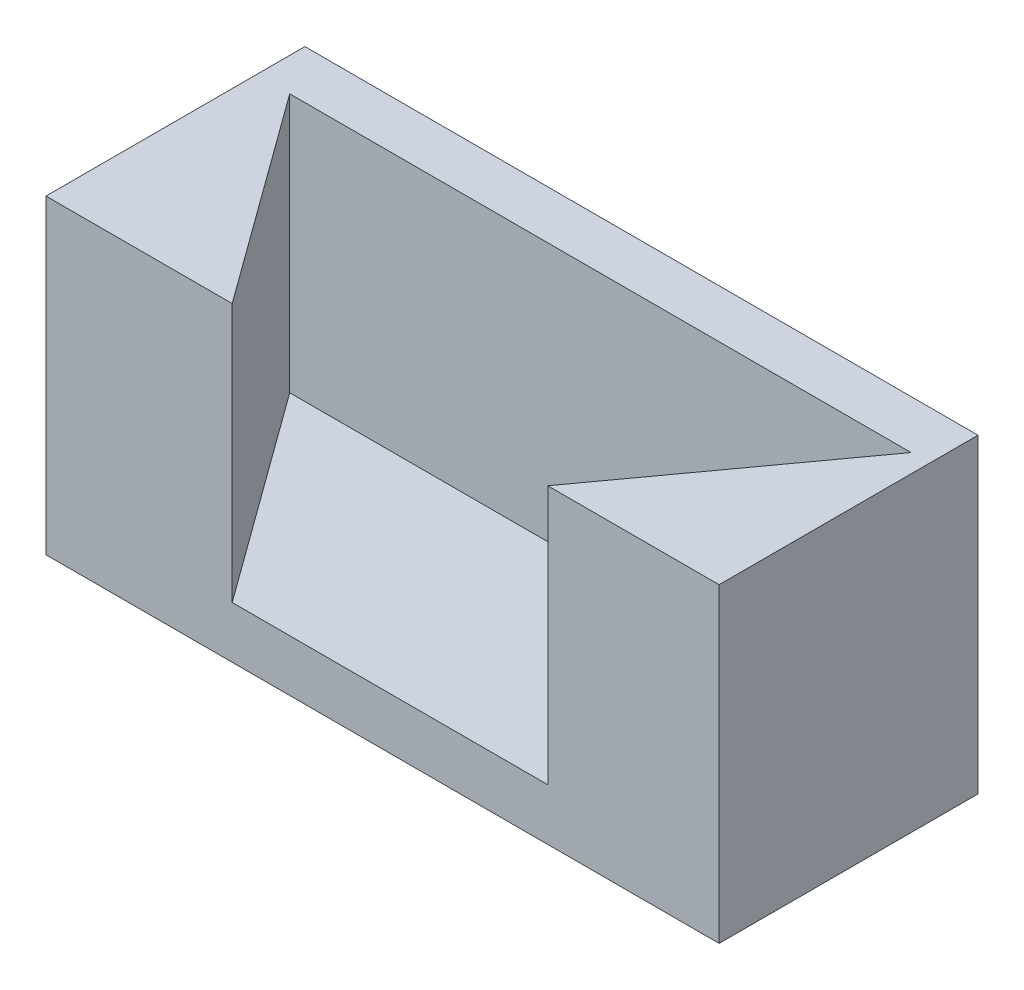
ISO-10303-21;
HEADER;
FILE_DESCRIPTION(('STEP AP214'),'2;1');
FILE_NAME('part.step','',(''),(''),'','','');
FILE_SCHEMA(('AUTOMOTIVE_DESIGN { 1 0 10303 214 1 1 1 1 }'));
ENDSEC;
DATA;
#1=APPLICATION_CONTEXT('core data for automotive mechanical design processes');
#2=APPLICATION_PROTOCOL_DEFINITION('international standard','automotive_design',2000,#1);
#3=PRODUCT_CONTEXT('',#1,'mechanical');
#4=PRODUCT('Part','Part','',(#3));
#5=PRODUCT_RELATED_PRODUCT_CATEGORY('part','',(#4));
#6=PRODUCT_DEFINITION_FORMATION('','',#4);
#7=PRODUCT_DEFINITION_CONTEXT('part definition',#1,'design');
#8=PRODUCT_DEFINITION('design','',#6,#7);
#9=PRODUCT_DEFINITION_SHAPE('','',#8);
#10=(LENGTH_UNIT() NAMED_UNIT(*) SI_UNIT(.MILLI.,.METRE.));
#11=(NAMED_UNIT(*) PLANE_ANGLE_UNIT() SI_UNIT($,.RADIAN.));
#12=(NAMED_UNIT(*) SI_UNIT($,.STERADIAN.) SOLID_ANGLE_UNIT());
#13=UNCERTAINTY_MEASURE_WITH_UNIT(LENGTH_MEASURE(1.E-05),#10,'distance_accuracy_value','');
#14=(GEOMETRIC_REPRESENTATION_CONTEXT(3) GLOBAL_UNCERTAINTY_ASSIGNED_CONTEXT((#13)) GLOBAL_UNIT_ASSIGNED_CONTEXT((#10,
#11,#12)) REPRESENTATION_CONTEXT('',''));
#15=CARTESIAN_POINT('',(0.,0.,0.));
#16=DIRECTION('',(0.,0.,1.));
#17=DIRECTION('',(1.,0.,0.));
#18=AXIS2_PLACEMENT_3D('',#15,#16,#17);
#19=CARTESIAN_POINT('',(6.5,6.,2.5));
#20=DIRECTION('',(-1.,0.,0.));
#21=DIRECTION('',(0.,0.,1.));
#22=AXIS2_PLACEMENT_3D('',#19,#20,#21);
#23=PLANE('',#22);
#24=DIRECTION('',(0.,0.,-1.));
#25=VECTOR('',#24,1.);
#26=CARTESIAN_POINT('',(6.5,0.,2.5));
#27=LINE('',#26,#25);
#28=CARTESIAN_POINT('',(6.5,0.,2.5));
#29=VERTEX_POINT('',#28);
#30=CARTESIAN_POINT('',(6.5,0.,-2.5));
#31=VERTEX_POINT('',#30);
#32=EDGE_CURVE('E155',#29,#31,#27,.T.);
#33=ORIENTED_EDGE('',*,*,#32,.T.);
#34=DIRECTION('',(0.,-1.,0.));
#35=VECTOR('',#34,1.);
#36=CARTESIAN_POINT('',(6.5,6.,-2.5));
#37=LINE('',#36,#35);
#38=CARTESIAN_POINT('',(6.5,6.,-2.5));
#39=VERTEX_POINT('',#38);
#40=EDGE_CURVE('E11',#39,#31,#37,.T.);
#41=ORIENTED_EDGE('',*,*,#40,.F.);
#42=DIRECTION('',(0.,0.,-1.));
#43=VECTOR('',#42,1.);
#44=CARTESIAN_POINT('',(6.5,6.,2.5));
#45=LINE('',#44,#43);
#46=CARTESIAN_POINT('',(6.5,6.,2.5));
#47=VERTEX_POINT('',#46);
#48=EDGE_CURVE('E142',#47,#39,#45,.T.);
#49=ORIENTED_EDGE('',*,*,#48,.F.);
#50=DIRECTION('',(0.,-1.,0.));
#51=VECTOR('',#50,1.);
#52=CARTESIAN_POINT('',(6.5,6.,2.5));
#53=LINE('',#52,#51);
#54=EDGE_CURVE('E154',#47,#29,#53,.T.);
#55=ORIENTED_EDGE('',*,*,#54,.T.);
#56=EDGE_LOOP('',(#33,#41,#49,#55));
#57=FACE_BOUND('',#56,.T.);
#58=ADVANCED_FACE('F39',(#57),#23,.F.);
#59=CARTESIAN_POINT('',(-6.5,6.,-2.5));
#60=DIRECTION('',(0.,0.,1.));
#61=DIRECTION('',(1.,0.,0.));
#62=AXIS2_PLACEMENT_3D('',#59,#60,#61);
#63=PLANE('',#62);
#64=DIRECTION('',(-1.,0.,0.));
#65=VECTOR('',#64,1.);
#66=CARTESIAN_POINT('',(-6.5,0.,-2.5));
#67=LINE('',#66,#65);
#68=CARTESIAN_POINT('',(-6.5,0.,-2.5));
#69=VERTEX_POINT('',#68);
#70=EDGE_CURVE('E159',#31,#69,#67,.T.);
#71=ORIENTED_EDGE('',*,*,#70,.T.);
#72=DIRECTION('',(0.,-1.,0.));
#73=VECTOR('',#72,1.);
#74=CARTESIAN_POINT('',(-6.5,6.,-2.5));
#75=LINE('',#74,#73);
#76=CARTESIAN_POINT('',(-6.5,6.,-2.5));
#77=VERTEX_POINT('',#76);
#78=EDGE_CURVE('E47',#77,#69,#75,.T.);
#79=ORIENTED_EDGE('',*,*,#78,.F.);
#80=DIRECTION('',(-1.,0.,0.));
#81=VECTOR('',#80,1.);
#82=CARTESIAN_POINT('',(-6.5,6.,-2.5));
#83=LINE('',#82,#81);
#84=EDGE_CURVE('E91',#39,#77,#83,.T.);
#85=ORIENTED_EDGE('',*,*,#84,.F.);
#86=ORIENTED_EDGE('',*,*,#40,.T.);
#87=EDGE_LOOP('',(#71,#79,#85,#86));
#88=FACE_BOUND('',#87,.T.);
#89=ADVANCED_FACE('F216',(#88),#63,.F.);
#90=CARTESIAN_POINT('',(-6.5,6.,2.5));
#91=DIRECTION('',(1.,0.,0.));
#92=DIRECTION('',(0.,0.,-1.));
#93=AXIS2_PLACEMENT_3D('',#90,#91,#92);
#94=PLANE('',#93);
#95=DIRECTION('',(0.,0.,1.));
#96=VECTOR('',#95,1.);
#97=CARTESIAN_POINT('',(-6.5,0.,2.5));
#98=LINE('',#97,#96);
#99=CARTESIAN_POINT('',(-6.5,0.,2.5));
#100=VERTEX_POINT('',#99);
#101=EDGE_CURVE('E163',#69,#100,#98,.T.);
#102=ORIENTED_EDGE('',*,*,#101,.T.);
#103=DIRECTION('',(0.,-1.,0.));
#104=VECTOR('',#103,1.);
#105=CARTESIAN_POINT('',(-6.5,6.,2.5));
#106=LINE('',#105,#104);
#107=CARTESIAN_POINT('',(-6.5,6.,2.5));
#108=VERTEX_POINT('',#107);
#109=EDGE_CURVE('E170',#108,#100,#106,.T.);
#110=ORIENTED_EDGE('',*,*,#109,.F.);
#111=DIRECTION('',(0.,0.,1.));
#112=VECTOR('',#111,1.);
#113=CARTESIAN_POINT('',(-6.5,6.,2.5));
#114=LINE('',#113,#112);
#115=EDGE_CURVE('E147',#77,#108,#114,.T.);
#116=ORIENTED_EDGE('',*,*,#115,.F.);
#117=ORIENTED_EDGE('',*,*,#78,.T.);
#118=EDGE_LOOP('',(#102,#110,#116,#117));
#119=FACE_BOUND('',#118,.T.);
#120=ADVANCED_FACE('F177',(#119),#94,.F.);
#121=CARTESIAN_POINT('',(-6.5,6.,2.5));
#122=DIRECTION('',(0.,0.,-1.));
#123=DIRECTION('',(-1.,0.,0.));
#124=AXIS2_PLACEMENT_3D('',#121,#122,#123);
#125=PLANE('',#124);
#126=DIRECTION('',(1.,0.,0.));
#127=VECTOR('',#126,1.);
#128=CARTESIAN_POINT('',(-2.90419664991504,1.,2.5));
#129=LINE('',#128,#127);
#130=CARTESIAN_POINT('',(-2.90419664991504,1.,2.5));
#131=VERTEX_POINT('',#130);
#132=CARTESIAN_POINT('',(3.19105080238557,1.,2.5));
#133=VERTEX_POINT('',#132);
#134=EDGE_CURVE('E121',#131,#133,#129,.T.);
#135=ORIENTED_EDGE('',*,*,#134,.F.);
#136=DIRECTION('',(0.,1.,0.));
#137=VECTOR('',#136,1.);
#138=CARTESIAN_POINT('',(-2.90419664991504,1.,2.5));
#139=LINE('',#138,#137);
#140=CARTESIAN_POINT('',(-2.90419664991504,6.,2.5));
#141=VERTEX_POINT('',#140);
#142=EDGE_CURVE('E160',#131,#141,#139,.T.);
#143=ORIENTED_EDGE('',*,*,#142,.T.);
#144=DIRECTION('',(1.,0.,0.));
#145=VECTOR('',#144,1.);
#146=CARTESIAN_POINT('',(-6.5,6.,2.5));
#147=LINE('',#146,#145);
#148=EDGE_CURVE('E150',#108,#141,#147,.T.);
#149=ORIENTED_EDGE('',*,*,#148,.F.);
#150=ORIENTED_EDGE('',*,*,#109,.T.);
#151=DIRECTION('',(1.,0.,0.));
#152=VECTOR('',#151,1.);
#153=CARTESIAN_POINT('',(-6.5,0.,2.5));
#154=LINE('',#153,#152);
#155=EDGE_CURVE('E84',#100,#29,#154,.T.);
#156=ORIENTED_EDGE('',*,*,#155,.T.);
#157=ORIENTED_EDGE('',*,*,#54,.F.);
#158=CARTESIAN_POINT('',(3.19105080238557,6.,2.5));
#159=VERTEX_POINT('',#158);
#160=EDGE_CURVE('E62',#159,#47,#147,.T.);
#161=ORIENTED_EDGE('',*,*,#160,.F.);
#162=DIRECTION('',(0.,1.,0.));
#163=VECTOR('',#162,1.);
#164=CARTESIAN_POINT('',(3.19105080238557,1.,2.5));
#165=LINE('',#164,#163);
#166=EDGE_CURVE('E54',#133,#159,#165,.T.);
#167=ORIENTED_EDGE('',*,*,#166,.F.);
#168=EDGE_LOOP('',(#135,#143,#149,#150,#156,#157,#161,#167));
#169=FACE_BOUND('',#168,.T.);
#170=ADVANCED_FACE('F132',(#169),#125,.F.);
#171=CARTESIAN_POINT('',(0.,6.,0.));
#172=DIRECTION('',(0.,-1.,0.));
#173=DIRECTION('',(0.,0.,-1.));
#174=AXIS2_PLACEMENT_3D('',#171,#172,#173);
#175=PLANE('',#174);
#176=ORIENTED_EDGE('',*,*,#148,.T.);
#177=DIRECTION('',(0.587785252292478,0.,0.809016994374944));
#178=VECTOR('',#177,1.);
#179=CARTESIAN_POINT('',(-2.90419664991504,6.,2.5));
#180=LINE('',#179,#178);
#181=CARTESIAN_POINT('',(-5.85657292376474,6.,-1.56359732575473));
#182=VERTEX_POINT('',#181);
#183=EDGE_CURVE('E130',#182,#141,#180,.T.);
#184=ORIENTED_EDGE('',*,*,#183,.F.);
#185=DIRECTION('',(-1.,0.,0.));
#186=VECTOR('',#185,1.);
#187=CARTESIAN_POINT('',(-5.85657292376474,6.,-1.56359732575473));
#188=LINE('',#187,#186);
#189=CARTESIAN_POINT('',(6.14342707623526,6.,-1.56359732575473));
#190=VERTEX_POINT('',#189);
#191=EDGE_CURVE('E195',#190,#182,#188,.T.);
#192=ORIENTED_EDGE('',*,*,#191,.F.);
#193=DIRECTION('',(0.587785252292477,0.,-0.809016994374945));
#194=VECTOR('',#193,1.);
#195=CARTESIAN_POINT('',(6.14342707623526,6.,-1.56359732575473));
#196=LINE('',#195,#194);
#197=EDGE_CURVE('E199',#159,#190,#196,.T.);
#198=ORIENTED_EDGE('',*,*,#197,.F.);
#199=ORIENTED_EDGE('',*,*,#160,.T.);
#200=ORIENTED_EDGE('',*,*,#48,.T.);
#201=ORIENTED_EDGE('',*,*,#84,.T.);
#202=ORIENTED_EDGE('',*,*,#115,.T.);
#203=EDGE_LOOP('',(#176,#184,#192,#198,#199,#200,#201,#202));
#204=FACE_BOUND('',#203,.T.);
#205=ADVANCED_FACE('F185',(#204),#175,.F.);
#206=CARTESIAN_POINT('',(0.,0.,0.));
#207=DIRECTION('',(0.,-1.,0.));
#208=DIRECTION('',(0.,0.,-1.));
#209=AXIS2_PLACEMENT_3D('',#206,#207,#208);
#210=PLANE('',#209);
#211=ORIENTED_EDGE('',*,*,#32,.F.);
#212=ORIENTED_EDGE('',*,*,#155,.F.);
#213=ORIENTED_EDGE('',*,*,#101,.F.);
#214=ORIENTED_EDGE('',*,*,#70,.F.);
#215=EDGE_LOOP('',(#211,#212,#213,#214));
#216=FACE_BOUND('',#215,.T.);
#217=ADVANCED_FACE('F181',(#216),#210,.T.);
#218=CARTESIAN_POINT('',(-2.90419664991504,1.,2.5));
#219=DIRECTION('',(-0.809016994374944,0.,0.587785252292478));
#220=DIRECTION('',(0.587785252292478,0.,0.809016994374944));
#221=AXIS2_PLACEMENT_3D('',#218,#219,#220);
#222=PLANE('',#221);
#223=ORIENTED_EDGE('',*,*,#183,.T.);
#224=ORIENTED_EDGE('',*,*,#142,.F.);
#225=DIRECTION('',(0.587785252292478,0.,0.809016994374944));
#226=VECTOR('',#225,1.);
#227=CARTESIAN_POINT('',(-2.90419664991504,1.,2.5));
#228=LINE('',#227,#226);
#229=CARTESIAN_POINT('',(-5.85657292376474,1.,-1.56359732575473));
#230=VERTEX_POINT('',#229);
#231=EDGE_CURVE('E127',#230,#131,#228,.T.);
#232=ORIENTED_EDGE('',*,*,#231,.F.);
#233=DIRECTION('',(0.,1.,0.));
#234=VECTOR('',#233,1.);
#235=CARTESIAN_POINT('',(-5.85657292376474,1.,-1.56359732575473));
#236=LINE('',#235,#234);
#237=EDGE_CURVE('E137',#230,#182,#236,.T.);
#238=ORIENTED_EDGE('',*,*,#237,.T.);
#239=EDGE_LOOP('',(#223,#224,#232,#238));
#240=FACE_BOUND('',#239,.T.);
#241=ADVANCED_FACE('F204',(#240),#222,.F.);
#242=CARTESIAN_POINT('',(-5.85657292376474,1.,-1.56359732575473));
#243=DIRECTION('',(0.,0.,-1.));
#244=DIRECTION('',(-1.,0.,0.));
#245=AXIS2_PLACEMENT_3D('',#242,#243,#244);
#246=PLANE('',#245);
#247=ORIENTED_EDGE('',*,*,#191,.T.);
#248=ORIENTED_EDGE('',*,*,#237,.F.);
#249=DIRECTION('',(-1.,0.,0.));
#250=VECTOR('',#249,1.);
#251=CARTESIAN_POINT('',(-5.85657292376474,1.,-1.56359732575473));
#252=LINE('',#251,#250);
#253=CARTESIAN_POINT('',(6.14342707623526,1.,-1.56359732575473));
#254=VERTEX_POINT('',#253);
#255=EDGE_CURVE('E120',#254,#230,#252,.T.);
#256=ORIENTED_EDGE('',*,*,#255,.F.);
#257=DIRECTION('',(0.,1.,0.));
#258=VECTOR('',#257,1.);
#259=CARTESIAN_POINT('',(6.14342707623526,1.,-1.56359732575473));
#260=LINE('',#259,#258);
#261=EDGE_CURVE('E115',#254,#190,#260,.T.);
#262=ORIENTED_EDGE('',*,*,#261,.T.);
#263=EDGE_LOOP('',(#247,#248,#256,#262));
#264=FACE_BOUND('',#263,.T.);
#265=ADVANCED_FACE('F206',(#264),#246,.F.);
#266=CARTESIAN_POINT('',(6.14342707623526,1.,-1.56359732575473));
#267=DIRECTION('',(0.809016994374945,0.,0.587785252292477));
#268=DIRECTION('',(0.587785252292477,0.,-0.809016994374945));
#269=AXIS2_PLACEMENT_3D('',#266,#267,#268);
#270=PLANE('',#269);
#271=ORIENTED_EDGE('',*,*,#197,.T.);
#272=ORIENTED_EDGE('',*,*,#261,.F.);
#273=DIRECTION('',(0.587785252292477,0.,-0.809016994374945));
#274=VECTOR('',#273,1.);
#275=CARTESIAN_POINT('',(6.14342707623526,1.,-1.56359732575473));
#276=LINE('',#275,#274);
#277=EDGE_CURVE('E112',#133,#254,#276,.T.);
#278=ORIENTED_EDGE('',*,*,#277,.F.);
#279=ORIENTED_EDGE('',*,*,#166,.T.);
#280=EDGE_LOOP('',(#271,#272,#278,#279));
#281=FACE_BOUND('',#280,.T.);
#282=ADVANCED_FACE('F114',(#281),#270,.F.);
#283=CARTESIAN_POINT('',(0.,1.,0.));
#284=DIRECTION('',(0.,-1.,0.));
#285=DIRECTION('',(0.,0.,-1.));
#286=AXIS2_PLACEMENT_3D('',#283,#284,#285);
#287=PLANE('',#286);
#288=ORIENTED_EDGE('',*,*,#134,.T.);
#289=ORIENTED_EDGE('',*,*,#277,.T.);
#290=ORIENTED_EDGE('',*,*,#255,.T.);
#291=ORIENTED_EDGE('',*,*,#231,.T.);
#292=EDGE_LOOP('',(#288,#289,#290,#291));
#293=FACE_BOUND('',#292,.T.);
#294=ADVANCED_FACE('F125',(#293),#287,.F.);
#295=CLOSED_SHELL('',(#58,#89,#120,#170,#205,#217,#241,#265,#282,#294));
#296=MANIFOLD_SOLID_BREP('B2',#295);
#297=ADVANCED_BREP_SHAPE_REPRESENTATION('',(#18,#296),#14);
#298=SHAPE_DEFINITION_REPRESENTATION(#9,#297);
ENDSEC;
END-ISO-10303-21;
